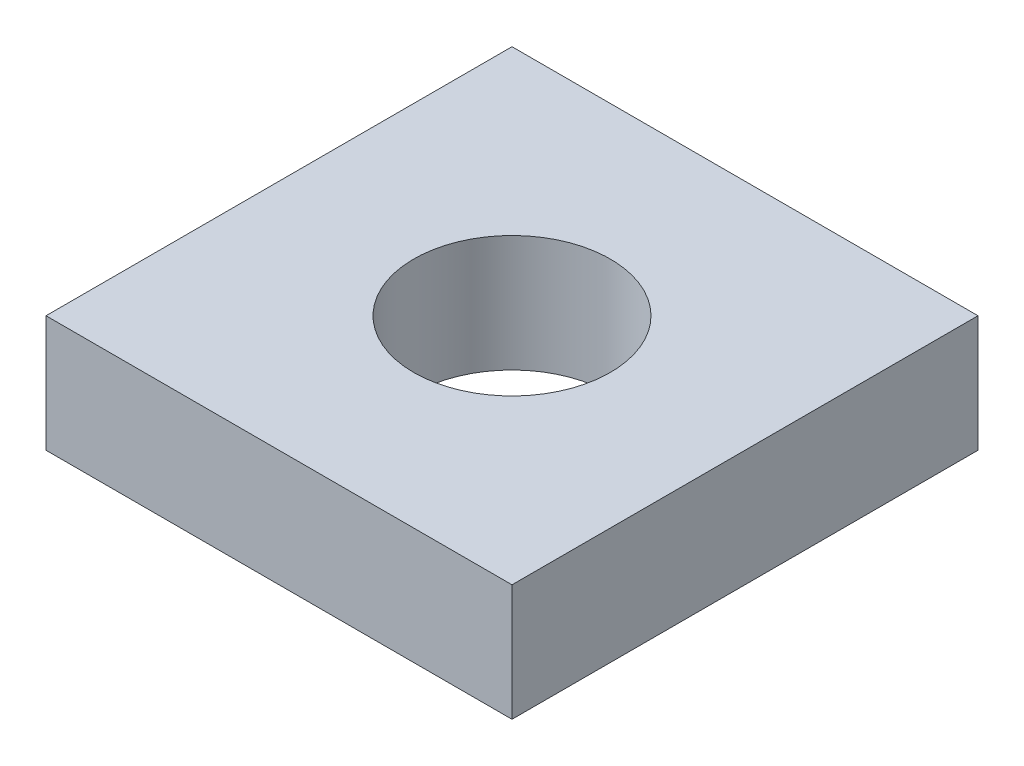
ISO-10303-21;
HEADER;
FILE_DESCRIPTION(('STEP AP214'),'2;1');
FILE_NAME('part.step','',(''),(''),'','','');
FILE_SCHEMA(('AUTOMOTIVE_DESIGN { 1 0 10303 214 1 1 1 1 }'));
ENDSEC;
DATA;
#1=APPLICATION_CONTEXT('core data for automotive mechanical design processes');
#2=APPLICATION_PROTOCOL_DEFINITION('international standard','automotive_design',2000,#1);
#3=PRODUCT_CONTEXT('',#1,'mechanical');
#4=PRODUCT('Part','Part','',(#3));
#5=PRODUCT_RELATED_PRODUCT_CATEGORY('part','',(#4));
#6=PRODUCT_DEFINITION_FORMATION('','',#4);
#7=PRODUCT_DEFINITION_CONTEXT('part definition',#1,'design');
#8=PRODUCT_DEFINITION('design','',#6,#7);
#9=PRODUCT_DEFINITION_SHAPE('','',#8);
#10=(LENGTH_UNIT() NAMED_UNIT(*) SI_UNIT(.MILLI.,.METRE.));
#11=(NAMED_UNIT(*) PLANE_ANGLE_UNIT() SI_UNIT($,.RADIAN.));
#12=(NAMED_UNIT(*) SI_UNIT($,.STERADIAN.) SOLID_ANGLE_UNIT());
#13=UNCERTAINTY_MEASURE_WITH_UNIT(LENGTH_MEASURE(1.E-05),#10,'distance_accuracy_value','');
#14=(GEOMETRIC_REPRESENTATION_CONTEXT(3) GLOBAL_UNCERTAINTY_ASSIGNED_CONTEXT((#13)) GLOBAL_UNIT_ASSIGNED_CONTEXT((#10,
#11,#12)) REPRESENTATION_CONTEXT('',''));
#15=CARTESIAN_POINT('',(0.,0.,0.));
#16=DIRECTION('',(0.,0.,1.));
#17=DIRECTION('',(1.,0.,0.));
#18=AXIS2_PLACEMENT_3D('',#15,#16,#17);
#19=CARTESIAN_POINT('',(0.,6.35,0.));
#20=DIRECTION('',(0.,-1.,0.));
#21=DIRECTION('',(0.,0.,-1.));
#22=AXIS2_PLACEMENT_3D('',#19,#20,#21);
#23=PLANE('',#22);
#24=DIRECTION('',(0.,0.,-1.));
#25=VECTOR('',#24,1.);
#26=CARTESIAN_POINT('',(12.7,6.35,12.7));
#27=LINE('',#26,#25);
#28=CARTESIAN_POINT('',(12.7,6.35,12.7));
#29=VERTEX_POINT('',#28);
#30=CARTESIAN_POINT('',(12.7,6.35,-12.7));
#31=VERTEX_POINT('',#30);
#32=EDGE_CURVE('E84',#29,#31,#27,.T.);
#33=ORIENTED_EDGE('',*,*,#32,.T.);
#34=DIRECTION('',(-1.,0.,0.));
#35=VECTOR('',#34,1.);
#36=CARTESIAN_POINT('',(-12.7,6.35,-12.7));
#37=LINE('',#36,#35);
#38=CARTESIAN_POINT('',(-12.7,6.35,-12.7));
#39=VERTEX_POINT('',#38);
#40=EDGE_CURVE('E79',#31,#39,#37,.T.);
#41=ORIENTED_EDGE('',*,*,#40,.T.);
#42=DIRECTION('',(0.,0.,1.));
#43=VECTOR('',#42,1.);
#44=CARTESIAN_POINT('',(-12.7,6.35,12.7));
#45=LINE('',#44,#43);
#46=CARTESIAN_POINT('',(-12.7,6.35,12.7));
#47=VERTEX_POINT('',#46);
#48=EDGE_CURVE('E82',#39,#47,#45,.T.);
#49=ORIENTED_EDGE('',*,*,#48,.T.);
#50=DIRECTION('',(1.,0.,0.));
#51=VECTOR('',#50,1.);
#52=CARTESIAN_POINT('',(-12.7,6.35,12.7));
#53=LINE('',#52,#51);
#54=EDGE_CURVE('E49',#47,#29,#53,.T.);
#55=ORIENTED_EDGE('',*,*,#54,.T.);
#56=EDGE_LOOP('',(#33,#41,#49,#55));
#57=FACE_BOUND('',#56,.T.);
#58=CARTESIAN_POINT('',(0.,6.35,0.));
#59=DIRECTION('',(0.,1.,0.));
#60=DIRECTION('',(0.,0.,1.));
#61=AXIS2_PLACEMENT_3D('',#58,#59,#60);
#62=CIRCLE('',#61,5.3578125);
#63=CARTESIAN_POINT('',(0.,6.35,5.3578125));
#64=VERTEX_POINT('',#63);
#65=EDGE_CURVE('E99',#64,#64,#62,.T.);
#66=ORIENTED_EDGE('',*,*,#65,.F.);
#67=EDGE_LOOP('',(#66));
#68=FACE_BOUND('',#67,.T.);
#69=ADVANCED_FACE('F32',(#57,#68),#23,.F.);
#70=CARTESIAN_POINT('',(0.,0.,0.));
#71=DIRECTION('',(0.,-1.,0.));
#72=DIRECTION('',(0.,0.,-1.));
#73=AXIS2_PLACEMENT_3D('',#70,#71,#72);
#74=PLANE('',#73);
#75=DIRECTION('',(0.,0.,-1.));
#76=VECTOR('',#75,1.);
#77=CARTESIAN_POINT('',(12.7,0.,12.7));
#78=LINE('',#77,#76);
#79=CARTESIAN_POINT('',(12.7,0.,12.7));
#80=VERTEX_POINT('',#79);
#81=CARTESIAN_POINT('',(12.7,0.,-12.7));
#82=VERTEX_POINT('',#81);
#83=EDGE_CURVE('E96',#80,#82,#78,.T.);
#84=ORIENTED_EDGE('',*,*,#83,.F.);
#85=DIRECTION('',(1.,0.,0.));
#86=VECTOR('',#85,1.);
#87=CARTESIAN_POINT('',(-12.7,0.,12.7));
#88=LINE('',#87,#86);
#89=CARTESIAN_POINT('',(-12.7,0.,12.7));
#90=VERTEX_POINT('',#89);
#91=EDGE_CURVE('E72',#90,#80,#88,.T.);
#92=ORIENTED_EDGE('',*,*,#91,.F.);
#93=DIRECTION('',(0.,0.,1.));
#94=VECTOR('',#93,1.);
#95=CARTESIAN_POINT('',(-12.7,0.,12.7));
#96=LINE('',#95,#94);
#97=CARTESIAN_POINT('',(-12.7,0.,-12.7));
#98=VERTEX_POINT('',#97);
#99=EDGE_CURVE('E66',#98,#90,#96,.T.);
#100=ORIENTED_EDGE('',*,*,#99,.F.);
#101=DIRECTION('',(-1.,0.,0.));
#102=VECTOR('',#101,1.);
#103=CARTESIAN_POINT('',(-12.7,0.,-12.7));
#104=LINE('',#103,#102);
#105=EDGE_CURVE('E88',#82,#98,#104,.T.);
#106=ORIENTED_EDGE('',*,*,#105,.F.);
#107=EDGE_LOOP('',(#84,#92,#100,#106));
#108=FACE_BOUND('',#107,.T.);
#109=CARTESIAN_POINT('',(0.,0.,0.));
#110=DIRECTION('',(0.,1.,0.));
#111=DIRECTION('',(0.,0.,1.));
#112=AXIS2_PLACEMENT_3D('',#109,#110,#111);
#113=CIRCLE('',#112,5.3578125);
#114=CARTESIAN_POINT('',(0.,0.,5.3578125));
#115=VERTEX_POINT('',#114);
#116=EDGE_CURVE('E111',#115,#115,#113,.T.);
#117=ORIENTED_EDGE('',*,*,#116,.T.);
#118=EDGE_LOOP('',(#117));
#119=FACE_BOUND('',#118,.T.);
#120=ADVANCED_FACE('F107',(#108,#119),#74,.T.);
#121=CARTESIAN_POINT('',(12.7,6.35,12.7));
#122=DIRECTION('',(-1.,0.,0.));
#123=DIRECTION('',(0.,0.,1.));
#124=AXIS2_PLACEMENT_3D('',#121,#122,#123);
#125=PLANE('',#124);
#126=ORIENTED_EDGE('',*,*,#83,.T.);
#127=DIRECTION('',(0.,-1.,0.));
#128=VECTOR('',#127,1.);
#129=CARTESIAN_POINT('',(12.7,6.35,-12.7));
#130=LINE('',#129,#128);
#131=EDGE_CURVE('E11',#31,#82,#130,.T.);
#132=ORIENTED_EDGE('',*,*,#131,.F.);
#133=ORIENTED_EDGE('',*,*,#32,.F.);
#134=DIRECTION('',(0.,-1.,0.));
#135=VECTOR('',#134,1.);
#136=CARTESIAN_POINT('',(12.7,6.35,12.7));
#137=LINE('',#136,#135);
#138=EDGE_CURVE('E92',#29,#80,#137,.T.);
#139=ORIENTED_EDGE('',*,*,#138,.T.);
#140=EDGE_LOOP('',(#126,#132,#133,#139));
#141=FACE_BOUND('',#140,.T.);
#142=ADVANCED_FACE('F34',(#141),#125,.F.);
#143=CARTESIAN_POINT('',(-12.7,6.35,-12.7));
#144=DIRECTION('',(0.,0.,1.));
#145=DIRECTION('',(1.,0.,0.));
#146=AXIS2_PLACEMENT_3D('',#143,#144,#145);
#147=PLANE('',#146);
#148=ORIENTED_EDGE('',*,*,#105,.T.);
#149=DIRECTION('',(0.,-1.,0.));
#150=VECTOR('',#149,1.);
#151=CARTESIAN_POINT('',(-12.7,6.35,-12.7));
#152=LINE('',#151,#150);
#153=EDGE_CURVE('E41',#39,#98,#152,.T.);
#154=ORIENTED_EDGE('',*,*,#153,.F.);
#155=ORIENTED_EDGE('',*,*,#40,.F.);
#156=ORIENTED_EDGE('',*,*,#131,.T.);
#157=EDGE_LOOP('',(#148,#154,#155,#156));
#158=FACE_BOUND('',#157,.T.);
#159=ADVANCED_FACE('F87',(#158),#147,.F.);
#160=CARTESIAN_POINT('',(-12.7,6.35,12.7));
#161=DIRECTION('',(1.,0.,0.));
#162=DIRECTION('',(0.,0.,-1.));
#163=AXIS2_PLACEMENT_3D('',#160,#161,#162);
#164=PLANE('',#163);
#165=ORIENTED_EDGE('',*,*,#99,.T.);
#166=DIRECTION('',(0.,-1.,0.));
#167=VECTOR('',#166,1.);
#168=CARTESIAN_POINT('',(-12.7,6.35,12.7));
#169=LINE('',#168,#167);
#170=EDGE_CURVE('E89',#47,#90,#169,.T.);
#171=ORIENTED_EDGE('',*,*,#170,.F.);
#172=ORIENTED_EDGE('',*,*,#48,.F.);
#173=ORIENTED_EDGE('',*,*,#153,.T.);
#174=EDGE_LOOP('',(#165,#171,#172,#173));
#175=FACE_BOUND('',#174,.T.);
#176=ADVANCED_FACE('F90',(#175),#164,.F.);
#177=CARTESIAN_POINT('',(-12.7,6.35,12.7));
#178=DIRECTION('',(0.,0.,-1.));
#179=DIRECTION('',(-1.,0.,0.));
#180=AXIS2_PLACEMENT_3D('',#177,#178,#179);
#181=PLANE('',#180);
#182=ORIENTED_EDGE('',*,*,#91,.T.);
#183=ORIENTED_EDGE('',*,*,#138,.F.);
#184=ORIENTED_EDGE('',*,*,#54,.F.);
#185=ORIENTED_EDGE('',*,*,#170,.T.);
#186=EDGE_LOOP('',(#182,#183,#184,#185));
#187=FACE_BOUND('',#186,.T.);
#188=ADVANCED_FACE('F104',(#187),#181,.F.);
#189=CARTESIAN_POINT('',(0.,6.35,0.));
#190=DIRECTION('',(0.,-1.,0.));
#191=DIRECTION('',(0.,0.,-1.));
#192=AXIS2_PLACEMENT_3D('',#189,#190,#191);
#193=CYLINDRICAL_SURFACE('',#192,5.3578125);
#194=ORIENTED_EDGE('',*,*,#65,.T.);
#195=EDGE_LOOP('',(#194));
#196=FACE_BOUND('',#195,.T.);
#197=ORIENTED_EDGE('',*,*,#116,.F.);
#198=EDGE_LOOP('',(#197));
#199=FACE_BOUND('',#198,.T.);
#200=ADVANCED_FACE('F117',(#196,#199),#193,.F.);
#201=CLOSED_SHELL('',(#69,#120,#142,#159,#176,#188,#200));
#202=MANIFOLD_SOLID_BREP('B2',#201);
#203=ADVANCED_BREP_SHAPE_REPRESENTATION('',(#18,#202),#14);
#204=SHAPE_DEFINITION_REPRESENTATION(#9,#203);
ENDSEC;
END-ISO-10303-21;
